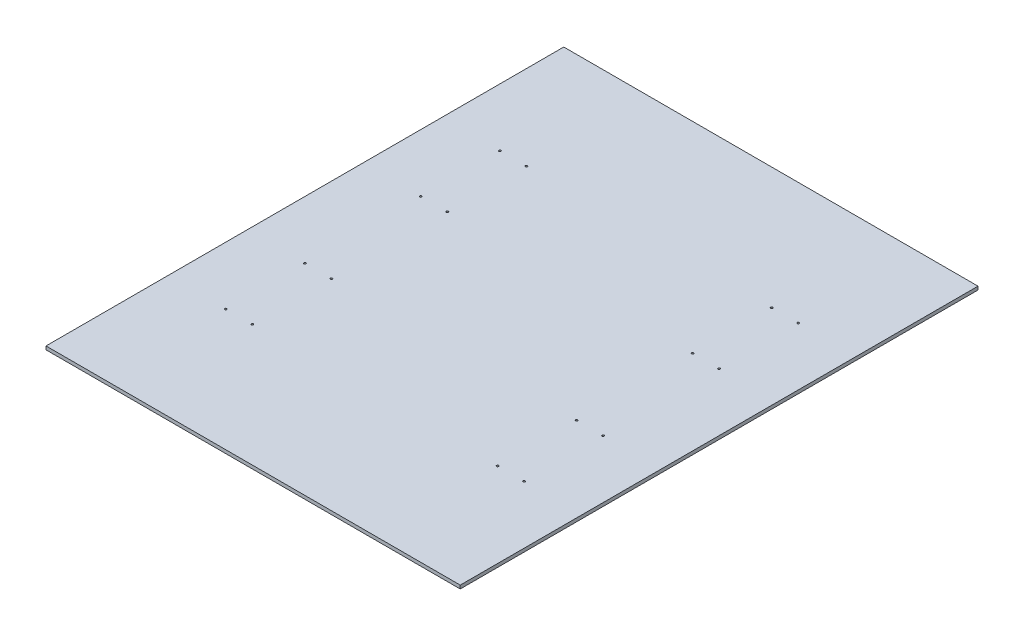
ISO-10303-21;
HEADER;
FILE_DESCRIPTION(('STEP AP214'),'2;1');
FILE_NAME('part.step','',(''),(''),'','','');
FILE_SCHEMA(('AUTOMOTIVE_DESIGN { 1 0 10303 214 1 1 1 1 }'));
ENDSEC;
DATA;
#1=APPLICATION_CONTEXT('core data for automotive mechanical design processes');
#2=APPLICATION_PROTOCOL_DEFINITION('international standard','automotive_design',2000,#1);
#3=PRODUCT_CONTEXT('',#1,'mechanical');
#4=PRODUCT('Part','Part','',(#3));
#5=PRODUCT_RELATED_PRODUCT_CATEGORY('part','',(#4));
#6=PRODUCT_DEFINITION_FORMATION('','',#4);
#7=PRODUCT_DEFINITION_CONTEXT('part definition',#1,'design');
#8=PRODUCT_DEFINITION('design','',#6,#7);
#9=PRODUCT_DEFINITION_SHAPE('','',#8);
#10=(LENGTH_UNIT() NAMED_UNIT(*) SI_UNIT(.MILLI.,.METRE.));
#11=(NAMED_UNIT(*) PLANE_ANGLE_UNIT() SI_UNIT($,.RADIAN.));
#12=(NAMED_UNIT(*) SI_UNIT($,.STERADIAN.) SOLID_ANGLE_UNIT());
#13=UNCERTAINTY_MEASURE_WITH_UNIT(LENGTH_MEASURE(1.E-05),#10,'distance_accuracy_value','');
#14=(GEOMETRIC_REPRESENTATION_CONTEXT(3) GLOBAL_UNCERTAINTY_ASSIGNED_CONTEXT((#13)) GLOBAL_UNIT_ASSIGNED_CONTEXT((#10,
#11,#12)) REPRESENTATION_CONTEXT('',''));
#15=CARTESIAN_POINT('',(0.,0.,0.));
#16=DIRECTION('',(0.,0.,1.));
#17=DIRECTION('',(1.,0.,0.));
#18=AXIS2_PLACEMENT_3D('',#15,#16,#17);
#19=CARTESIAN_POINT('',(609.6,10.,-762.));
#20=DIRECTION('',(-1.,0.,0.));
#21=DIRECTION('',(0.,0.,1.));
#22=AXIS2_PLACEMENT_3D('',#19,#20,#21);
#23=PLANE('',#22);
#24=DIRECTION('',(0.,0.,-1.));
#25=VECTOR('',#24,1.);
#26=CARTESIAN_POINT('',(609.6,0.,-762.));
#27=LINE('',#26,#25);
#28=CARTESIAN_POINT('',(609.6,0.,762.));
#29=VERTEX_POINT('',#28);
#30=CARTESIAN_POINT('',(609.6,0.,-762.));
#31=VERTEX_POINT('',#30);
#32=EDGE_CURVE('E112',#29,#31,#27,.T.);
#33=ORIENTED_EDGE('',*,*,#32,.T.);
#34=DIRECTION('',(0.,-1.,0.));
#35=VECTOR('',#34,1.);
#36=CARTESIAN_POINT('',(609.6,10.,-762.));
#37=LINE('',#36,#35);
#38=CARTESIAN_POINT('',(609.6,10.,-762.));
#39=VERTEX_POINT('',#38);
#40=EDGE_CURVE('E11',#39,#31,#37,.T.);
#41=ORIENTED_EDGE('',*,*,#40,.F.);
#42=DIRECTION('',(0.,0.,-1.));
#43=VECTOR('',#42,1.);
#44=CARTESIAN_POINT('',(609.6,10.,-762.));
#45=LINE('',#44,#43);
#46=CARTESIAN_POINT('',(609.6,10.,762.));
#47=VERTEX_POINT('',#46);
#48=EDGE_CURVE('E96',#47,#39,#45,.T.);
#49=ORIENTED_EDGE('',*,*,#48,.F.);
#50=DIRECTION('',(0.,-1.,0.));
#51=VECTOR('',#50,1.);
#52=CARTESIAN_POINT('',(609.6,10.,762.));
#53=LINE('',#52,#51);
#54=EDGE_CURVE('E108',#47,#29,#53,.T.);
#55=ORIENTED_EDGE('',*,*,#54,.T.);
#56=EDGE_LOOP('',(#33,#41,#49,#55));
#57=FACE_BOUND('',#56,.T.);
#58=ADVANCED_FACE('F44',(#57),#23,.F.);
#59=CARTESIAN_POINT('',(-609.6,10.,-762.));
#60=DIRECTION('',(0.,0.,1.));
#61=DIRECTION('',(1.,0.,0.));
#62=AXIS2_PLACEMENT_3D('',#59,#60,#61);
#63=PLANE('',#62);
#64=DIRECTION('',(-1.,0.,0.));
#65=VECTOR('',#64,1.);
#66=CARTESIAN_POINT('',(-609.6,0.,-762.));
#67=LINE('',#66,#65);
#68=CARTESIAN_POINT('',(-609.6,0.,-762.));
#69=VERTEX_POINT('',#68);
#70=EDGE_CURVE('E101',#31,#69,#67,.T.);
#71=ORIENTED_EDGE('',*,*,#70,.T.);
#72=DIRECTION('',(0.,-1.,0.));
#73=VECTOR('',#72,1.);
#74=CARTESIAN_POINT('',(-609.6,10.,-762.));
#75=LINE('',#74,#73);
#76=CARTESIAN_POINT('',(-609.6,10.,-762.));
#77=VERTEX_POINT('',#76);
#78=EDGE_CURVE('E53',#77,#69,#75,.T.);
#79=ORIENTED_EDGE('',*,*,#78,.F.);
#80=DIRECTION('',(-1.,0.,0.));
#81=VECTOR('',#80,1.);
#82=CARTESIAN_POINT('',(-609.6,10.,-762.));
#83=LINE('',#82,#81);
#84=EDGE_CURVE('E91',#39,#77,#83,.T.);
#85=ORIENTED_EDGE('',*,*,#84,.F.);
#86=ORIENTED_EDGE('',*,*,#40,.T.);
#87=EDGE_LOOP('',(#71,#79,#85,#86));
#88=FACE_BOUND('',#87,.T.);
#89=ADVANCED_FACE('F100',(#88),#63,.F.);
#90=CARTESIAN_POINT('',(-609.6,10.,-762.));
#91=DIRECTION('',(1.,0.,0.));
#92=DIRECTION('',(0.,0.,-1.));
#93=AXIS2_PLACEMENT_3D('',#90,#91,#92);
#94=PLANE('',#93);
#95=DIRECTION('',(0.,0.,1.));
#96=VECTOR('',#95,1.);
#97=CARTESIAN_POINT('',(-609.6,0.,-762.));
#98=LINE('',#97,#96);
#99=CARTESIAN_POINT('',(-609.6,0.,762.));
#100=VERTEX_POINT('',#99);
#101=EDGE_CURVE('E78',#69,#100,#98,.T.);
#102=ORIENTED_EDGE('',*,*,#101,.T.);
#103=DIRECTION('',(0.,-1.,0.));
#104=VECTOR('',#103,1.);
#105=CARTESIAN_POINT('',(-609.6,10.,762.));
#106=LINE('',#105,#104);
#107=CARTESIAN_POINT('',(-609.6,10.,762.));
#108=VERTEX_POINT('',#107);
#109=EDGE_CURVE('E103',#108,#100,#106,.T.);
#110=ORIENTED_EDGE('',*,*,#109,.F.);
#111=DIRECTION('',(0.,0.,1.));
#112=VECTOR('',#111,1.);
#113=CARTESIAN_POINT('',(-609.6,10.,-762.));
#114=LINE('',#113,#112);
#115=EDGE_CURVE('E94',#77,#108,#114,.T.);
#116=ORIENTED_EDGE('',*,*,#115,.F.);
#117=ORIENTED_EDGE('',*,*,#78,.T.);
#118=EDGE_LOOP('',(#102,#110,#116,#117));
#119=FACE_BOUND('',#118,.T.);
#120=ADVANCED_FACE('F104',(#119),#94,.F.);
#121=CARTESIAN_POINT('',(-609.6,10.,762.));
#122=DIRECTION('',(0.,0.,-1.));
#123=DIRECTION('',(-1.,0.,0.));
#124=AXIS2_PLACEMENT_3D('',#121,#122,#123);
#125=PLANE('',#124);
#126=DIRECTION('',(1.,0.,0.));
#127=VECTOR('',#126,1.);
#128=CARTESIAN_POINT('',(-609.6,0.,762.));
#129=LINE('',#128,#127);
#130=EDGE_CURVE('E84',#100,#29,#129,.T.);
#131=ORIENTED_EDGE('',*,*,#130,.T.);
#132=ORIENTED_EDGE('',*,*,#54,.F.);
#133=DIRECTION('',(1.,0.,0.));
#134=VECTOR('',#133,1.);
#135=CARTESIAN_POINT('',(-609.6,10.,762.));
#136=LINE('',#135,#134);
#137=EDGE_CURVE('E61',#108,#47,#136,.T.);
#138=ORIENTED_EDGE('',*,*,#137,.F.);
#139=ORIENTED_EDGE('',*,*,#109,.T.);
#140=EDGE_LOOP('',(#131,#132,#138,#139));
#141=FACE_BOUND('',#140,.T.);
#142=ADVANCED_FACE('F126',(#141),#125,.F.);
#143=CARTESIAN_POINT('',(0.,10.,0.));
#144=DIRECTION('',(0.,1.,0.));
#145=DIRECTION('',(0.,0.,1.));
#146=AXIS2_PLACEMENT_3D('',#143,#144,#145);
#147=PLANE('',#146);
#148=CARTESIAN_POINT('',(439.,10.,170.65));
#149=DIRECTION('',(0.,1.,0.));
#150=DIRECTION('',(0.,0.,-1.));
#151=AXIS2_PLACEMENT_3D('',#148,#149,#150);
#152=CIRCLE('',#151,2.99999999999999);
#153=CARTESIAN_POINT('',(439.,10.,167.65));
#154=VERTEX_POINT('',#153);
#155=EDGE_CURVE('E237',#154,#154,#152,.T.);
#156=ORIENTED_EDGE('',*,*,#155,.F.);
#157=EDGE_LOOP('',(#156));
#158=FACE_BOUND('',#157,.T.);
#159=CARTESIAN_POINT('',(361.,10.,170.65));
#160=DIRECTION('',(0.,1.,0.));
#161=DIRECTION('',(0.,0.,-1.));
#162=AXIS2_PLACEMENT_3D('',#159,#160,#161);
#163=CIRCLE('',#162,2.99999999999999);
#164=CARTESIAN_POINT('',(361.,10.,167.65));
#165=VERTEX_POINT('',#164);
#166=EDGE_CURVE('E245',#165,#165,#163,.T.);
#167=ORIENTED_EDGE('',*,*,#166,.F.);
#168=EDGE_LOOP('',(#167));
#169=FACE_BOUND('',#168,.T.);
#170=CARTESIAN_POINT('',(361.,10.,403.35));
#171=DIRECTION('',(0.,1.,0.));
#172=DIRECTION('',(0.,0.,-1.));
#173=AXIS2_PLACEMENT_3D('',#170,#171,#172);
#174=CIRCLE('',#173,2.99999999999999);
#175=CARTESIAN_POINT('',(361.,10.,400.35));
#176=VERTEX_POINT('',#175);
#177=EDGE_CURVE('E253',#176,#176,#174,.T.);
#178=ORIENTED_EDGE('',*,*,#177,.F.);
#179=EDGE_LOOP('',(#178));
#180=FACE_BOUND('',#179,.T.);
#181=CARTESIAN_POINT('',(439.,10.,403.35));
#182=DIRECTION('',(0.,1.,0.));
#183=DIRECTION('',(0.,0.,-1.));
#184=AXIS2_PLACEMENT_3D('',#181,#182,#183);
#185=CIRCLE('',#184,2.99999999999999);
#186=CARTESIAN_POINT('',(439.,10.,400.35));
#187=VERTEX_POINT('',#186);
#188=EDGE_CURVE('E229',#187,#187,#185,.T.);
#189=ORIENTED_EDGE('',*,*,#188,.F.);
#190=EDGE_LOOP('',(#189));
#191=FACE_BOUND('',#190,.T.);
#192=CARTESIAN_POINT('',(439.,10.,-170.65));
#193=DIRECTION('',(0.,-1.,0.));
#194=DIRECTION('',(0.,0.,1.));
#195=AXIS2_PLACEMENT_3D('',#192,#193,#194);
#196=CIRCLE('',#195,2.99999999999999);
#197=CARTESIAN_POINT('',(439.,10.,-167.65));
#198=VERTEX_POINT('',#197);
#199=EDGE_CURVE('E205',#198,#198,#196,.T.);
#200=ORIENTED_EDGE('',*,*,#199,.T.);
#201=EDGE_LOOP('',(#200));
#202=FACE_BOUND('',#201,.T.);
#203=CARTESIAN_POINT('',(361.,10.,-170.65));
#204=DIRECTION('',(0.,-1.,0.));
#205=DIRECTION('',(0.,0.,1.));
#206=AXIS2_PLACEMENT_3D('',#203,#204,#205);
#207=CIRCLE('',#206,2.99999999999999);
#208=CARTESIAN_POINT('',(361.,10.,-167.65));
#209=VERTEX_POINT('',#208);
#210=EDGE_CURVE('E214',#209,#209,#207,.T.);
#211=ORIENTED_EDGE('',*,*,#210,.T.);
#212=EDGE_LOOP('',(#211));
#213=FACE_BOUND('',#212,.T.);
#214=CARTESIAN_POINT('',(361.,10.,-403.35));
#215=DIRECTION('',(0.,-1.,0.));
#216=DIRECTION('',(0.,0.,1.));
#217=AXIS2_PLACEMENT_3D('',#214,#215,#216);
#218=CIRCLE('',#217,2.99999999999999);
#219=CARTESIAN_POINT('',(361.,10.,-400.35));
#220=VERTEX_POINT('',#219);
#221=EDGE_CURVE('E222',#220,#220,#218,.T.);
#222=ORIENTED_EDGE('',*,*,#221,.T.);
#223=EDGE_LOOP('',(#222));
#224=FACE_BOUND('',#223,.T.);
#225=CARTESIAN_POINT('',(439.,10.,-403.35));
#226=DIRECTION('',(0.,-1.,0.));
#227=DIRECTION('',(0.,0.,1.));
#228=AXIS2_PLACEMENT_3D('',#225,#226,#227);
#229=CIRCLE('',#228,2.99999999999999);
#230=CARTESIAN_POINT('',(439.,10.,-400.35));
#231=VERTEX_POINT('',#230);
#232=EDGE_CURVE('E197',#231,#231,#229,.T.);
#233=ORIENTED_EDGE('',*,*,#232,.T.);
#234=EDGE_LOOP('',(#233));
#235=FACE_BOUND('',#234,.T.);
#236=CARTESIAN_POINT('',(-439.,10.,170.65));
#237=DIRECTION('',(0.,-1.,0.));
#238=DIRECTION('',(0.,0.,-1.));
#239=AXIS2_PLACEMENT_3D('',#236,#237,#238);
#240=CIRCLE('',#239,2.99999999999999);
#241=CARTESIAN_POINT('',(-439.,10.,167.65));
#242=VERTEX_POINT('',#241);
#243=EDGE_CURVE('E173',#242,#242,#240,.T.);
#244=ORIENTED_EDGE('',*,*,#243,.T.);
#245=EDGE_LOOP('',(#244));
#246=FACE_BOUND('',#245,.T.);
#247=CARTESIAN_POINT('',(-361.,10.,170.65));
#248=DIRECTION('',(0.,-1.,0.));
#249=DIRECTION('',(0.,0.,-1.));
#250=AXIS2_PLACEMENT_3D('',#247,#248,#249);
#251=CIRCLE('',#250,2.99999999999999);
#252=CARTESIAN_POINT('',(-361.,10.,167.65));
#253=VERTEX_POINT('',#252);
#254=EDGE_CURVE('E182',#253,#253,#251,.T.);
#255=ORIENTED_EDGE('',*,*,#254,.T.);
#256=EDGE_LOOP('',(#255));
#257=FACE_BOUND('',#256,.T.);
#258=CARTESIAN_POINT('',(-361.,10.,403.35));
#259=DIRECTION('',(0.,-1.,0.));
#260=DIRECTION('',(0.,0.,-1.));
#261=AXIS2_PLACEMENT_3D('',#258,#259,#260);
#262=CIRCLE('',#261,2.99999999999999);
#263=CARTESIAN_POINT('',(-361.,10.,400.35));
#264=VERTEX_POINT('',#263);
#265=EDGE_CURVE('E190',#264,#264,#262,.T.);
#266=ORIENTED_EDGE('',*,*,#265,.T.);
#267=EDGE_LOOP('',(#266));
#268=FACE_BOUND('',#267,.T.);
#269=CARTESIAN_POINT('',(-439.,10.,403.35));
#270=DIRECTION('',(0.,-1.,0.));
#271=DIRECTION('',(0.,0.,-1.));
#272=AXIS2_PLACEMENT_3D('',#269,#270,#271);
#273=CIRCLE('',#272,2.99999999999999);
#274=CARTESIAN_POINT('',(-439.,10.,400.35));
#275=VERTEX_POINT('',#274);
#276=EDGE_CURVE('E165',#275,#275,#273,.T.);
#277=ORIENTED_EDGE('',*,*,#276,.T.);
#278=EDGE_LOOP('',(#277));
#279=FACE_BOUND('',#278,.T.);
#280=CARTESIAN_POINT('',(-439.,10.,-170.65));
#281=DIRECTION('',(0.,1.,0.));
#282=DIRECTION('',(0.,0.,1.));
#283=AXIS2_PLACEMENT_3D('',#280,#281,#282);
#284=CIRCLE('',#283,2.99999999999999);
#285=CARTESIAN_POINT('',(-439.,10.,-167.65));
#286=VERTEX_POINT('',#285);
#287=EDGE_CURVE('E145',#286,#286,#284,.T.);
#288=ORIENTED_EDGE('',*,*,#287,.F.);
#289=EDGE_LOOP('',(#288));
#290=FACE_BOUND('',#289,.T.);
#291=CARTESIAN_POINT('',(-361.,10.,-170.65));
#292=DIRECTION('',(0.,1.,0.));
#293=DIRECTION('',(0.,0.,1.));
#294=AXIS2_PLACEMENT_3D('',#291,#292,#293);
#295=CIRCLE('',#294,2.99999999999999);
#296=CARTESIAN_POINT('',(-361.,10.,-167.65));
#297=VERTEX_POINT('',#296);
#298=EDGE_CURVE('E154',#297,#297,#295,.T.);
#299=ORIENTED_EDGE('',*,*,#298,.F.);
#300=EDGE_LOOP('',(#299));
#301=FACE_BOUND('',#300,.T.);
#302=CARTESIAN_POINT('',(-361.,10.,-403.35));
#303=DIRECTION('',(0.,1.,0.));
#304=DIRECTION('',(0.,0.,1.));
#305=AXIS2_PLACEMENT_3D('',#302,#303,#304);
#306=CIRCLE('',#305,2.99999999999999);
#307=CARTESIAN_POINT('',(-361.,10.,-400.35));
#308=VERTEX_POINT('',#307);
#309=EDGE_CURVE('E137',#308,#308,#306,.T.);
#310=ORIENTED_EDGE('',*,*,#309,.F.);
#311=EDGE_LOOP('',(#310));
#312=FACE_BOUND('',#311,.T.);
#313=CARTESIAN_POINT('',(-439.,10.,-403.35));
#314=DIRECTION('',(0.,1.,0.));
#315=DIRECTION('',(0.,0.,1.));
#316=AXIS2_PLACEMENT_3D('',#313,#314,#315);
#317=CIRCLE('',#316,2.99999999999999);
#318=CARTESIAN_POINT('',(-439.,10.,-400.35));
#319=VERTEX_POINT('',#318);
#320=EDGE_CURVE('E133',#319,#319,#317,.T.);
#321=ORIENTED_EDGE('',*,*,#320,.F.);
#322=EDGE_LOOP('',(#321));
#323=FACE_BOUND('',#322,.T.);
#324=ORIENTED_EDGE('',*,*,#48,.T.);
#325=ORIENTED_EDGE('',*,*,#84,.T.);
#326=ORIENTED_EDGE('',*,*,#115,.T.);
#327=ORIENTED_EDGE('',*,*,#137,.T.);
#328=EDGE_LOOP('',(#324,#325,#326,#327));
#329=FACE_BOUND('',#328,.T.);
#330=ADVANCED_FACE('F92',(#158,#169,#180,#191,#202,#213,#224,#235,#246,#257,#268,#279,#290,#301,
#312,#323,#329),#147,.T.);
#331=CARTESIAN_POINT('',(0.,0.,0.));
#332=DIRECTION('',(0.,1.,0.));
#333=DIRECTION('',(0.,0.,1.));
#334=AXIS2_PLACEMENT_3D('',#331,#332,#333);
#335=PLANE('',#334);
#336=CARTESIAN_POINT('',(439.,0.,170.65));
#337=DIRECTION('',(0.,1.,0.));
#338=DIRECTION('',(0.,0.,-1.));
#339=AXIS2_PLACEMENT_3D('',#336,#337,#338);
#340=CIRCLE('',#339,2.99999999999999);
#341=CARTESIAN_POINT('',(439.,0.,167.65));
#342=VERTEX_POINT('',#341);
#343=EDGE_CURVE('E241',#342,#342,#340,.T.);
#344=ORIENTED_EDGE('',*,*,#343,.T.);
#345=EDGE_LOOP('',(#344));
#346=FACE_BOUND('',#345,.T.);
#347=CARTESIAN_POINT('',(361.,0.,170.65));
#348=DIRECTION('',(0.,1.,0.));
#349=DIRECTION('',(0.,0.,-1.));
#350=AXIS2_PLACEMENT_3D('',#347,#348,#349);
#351=CIRCLE('',#350,2.99999999999999);
#352=CARTESIAN_POINT('',(361.,0.,167.65));
#353=VERTEX_POINT('',#352);
#354=EDGE_CURVE('E249',#353,#353,#351,.T.);
#355=ORIENTED_EDGE('',*,*,#354,.T.);
#356=EDGE_LOOP('',(#355));
#357=FACE_BOUND('',#356,.T.);
#358=CARTESIAN_POINT('',(361.,0.,403.35));
#359=DIRECTION('',(0.,1.,0.));
#360=DIRECTION('',(0.,0.,-1.));
#361=AXIS2_PLACEMENT_3D('',#358,#359,#360);
#362=CIRCLE('',#361,2.99999999999999);
#363=CARTESIAN_POINT('',(361.,0.,400.35));
#364=VERTEX_POINT('',#363);
#365=EDGE_CURVE('E233',#364,#364,#362,.T.);
#366=ORIENTED_EDGE('',*,*,#365,.T.);
#367=EDGE_LOOP('',(#366));
#368=FACE_BOUND('',#367,.T.);
#369=CARTESIAN_POINT('',(439.,0.,403.35));
#370=DIRECTION('',(0.,1.,0.));
#371=DIRECTION('',(0.,0.,-1.));
#372=AXIS2_PLACEMENT_3D('',#369,#370,#371);
#373=CIRCLE('',#372,2.99999999999999);
#374=CARTESIAN_POINT('',(439.,0.,400.35));
#375=VERTEX_POINT('',#374);
#376=EDGE_CURVE('E210',#375,#375,#373,.T.);
#377=ORIENTED_EDGE('',*,*,#376,.T.);
#378=EDGE_LOOP('',(#377));
#379=FACE_BOUND('',#378,.T.);
#380=CARTESIAN_POINT('',(439.,0.,-170.65));
#381=DIRECTION('',(0.,-1.,0.));
#382=DIRECTION('',(0.,0.,1.));
#383=AXIS2_PLACEMENT_3D('',#380,#381,#382);
#384=CIRCLE('',#383,2.99999999999999);
#385=CARTESIAN_POINT('',(439.,0.,-167.65));
#386=VERTEX_POINT('',#385);
#387=EDGE_CURVE('E209',#386,#386,#384,.T.);
#388=ORIENTED_EDGE('',*,*,#387,.F.);
#389=EDGE_LOOP('',(#388));
#390=FACE_BOUND('',#389,.T.);
#391=CARTESIAN_POINT('',(361.,0.,-170.65));
#392=DIRECTION('',(0.,-1.,0.));
#393=DIRECTION('',(0.,0.,1.));
#394=AXIS2_PLACEMENT_3D('',#391,#392,#393);
#395=CIRCLE('',#394,2.99999999999999);
#396=CARTESIAN_POINT('',(361.,0.,-167.65));
#397=VERTEX_POINT('',#396);
#398=EDGE_CURVE('E218',#397,#397,#395,.T.);
#399=ORIENTED_EDGE('',*,*,#398,.F.);
#400=EDGE_LOOP('',(#399));
#401=FACE_BOUND('',#400,.T.);
#402=CARTESIAN_POINT('',(361.,0.,-403.35));
#403=DIRECTION('',(0.,-1.,0.));
#404=DIRECTION('',(0.,0.,1.));
#405=AXIS2_PLACEMENT_3D('',#402,#403,#404);
#406=CIRCLE('',#405,2.99999999999999);
#407=CARTESIAN_POINT('',(361.,0.,-400.35));
#408=VERTEX_POINT('',#407);
#409=EDGE_CURVE('E201',#408,#408,#406,.T.);
#410=ORIENTED_EDGE('',*,*,#409,.F.);
#411=EDGE_LOOP('',(#410));
#412=FACE_BOUND('',#411,.T.);
#413=CARTESIAN_POINT('',(439.,0.,-403.35));
#414=DIRECTION('',(0.,-1.,0.));
#415=DIRECTION('',(0.,0.,1.));
#416=AXIS2_PLACEMENT_3D('',#413,#414,#415);
#417=CIRCLE('',#416,2.99999999999999);
#418=CARTESIAN_POINT('',(439.,0.,-400.35));
#419=VERTEX_POINT('',#418);
#420=EDGE_CURVE('E178',#419,#419,#417,.T.);
#421=ORIENTED_EDGE('',*,*,#420,.F.);
#422=EDGE_LOOP('',(#421));
#423=FACE_BOUND('',#422,.T.);
#424=CARTESIAN_POINT('',(-439.,0.,170.65));
#425=DIRECTION('',(0.,-1.,0.));
#426=DIRECTION('',(0.,0.,-1.));
#427=AXIS2_PLACEMENT_3D('',#424,#425,#426);
#428=CIRCLE('',#427,2.99999999999999);
#429=CARTESIAN_POINT('',(-439.,0.,167.65));
#430=VERTEX_POINT('',#429);
#431=EDGE_CURVE('E177',#430,#430,#428,.T.);
#432=ORIENTED_EDGE('',*,*,#431,.F.);
#433=EDGE_LOOP('',(#432));
#434=FACE_BOUND('',#433,.T.);
#435=CARTESIAN_POINT('',(-361.,0.,170.65));
#436=DIRECTION('',(0.,-1.,0.));
#437=DIRECTION('',(0.,0.,-1.));
#438=AXIS2_PLACEMENT_3D('',#435,#436,#437);
#439=CIRCLE('',#438,2.99999999999999);
#440=CARTESIAN_POINT('',(-361.,0.,167.65));
#441=VERTEX_POINT('',#440);
#442=EDGE_CURVE('E186',#441,#441,#439,.T.);
#443=ORIENTED_EDGE('',*,*,#442,.F.);
#444=EDGE_LOOP('',(#443));
#445=FACE_BOUND('',#444,.T.);
#446=CARTESIAN_POINT('',(-361.,0.,403.35));
#447=DIRECTION('',(0.,-1.,0.));
#448=DIRECTION('',(0.,0.,-1.));
#449=AXIS2_PLACEMENT_3D('',#446,#447,#448);
#450=CIRCLE('',#449,2.99999999999999);
#451=CARTESIAN_POINT('',(-361.,0.,400.35));
#452=VERTEX_POINT('',#451);
#453=EDGE_CURVE('E169',#452,#452,#450,.T.);
#454=ORIENTED_EDGE('',*,*,#453,.F.);
#455=EDGE_LOOP('',(#454));
#456=FACE_BOUND('',#455,.T.);
#457=CARTESIAN_POINT('',(-439.,0.,403.35));
#458=DIRECTION('',(0.,-1.,0.));
#459=DIRECTION('',(0.,0.,-1.));
#460=AXIS2_PLACEMENT_3D('',#457,#458,#459);
#461=CIRCLE('',#460,2.99999999999999);
#462=CARTESIAN_POINT('',(-439.,0.,400.35));
#463=VERTEX_POINT('',#462);
#464=EDGE_CURVE('E146',#463,#463,#461,.T.);
#465=ORIENTED_EDGE('',*,*,#464,.F.);
#466=EDGE_LOOP('',(#465));
#467=FACE_BOUND('',#466,.T.);
#468=CARTESIAN_POINT('',(-439.,0.,-170.65));
#469=DIRECTION('',(0.,1.,0.));
#470=DIRECTION('',(0.,0.,1.));
#471=AXIS2_PLACEMENT_3D('',#468,#469,#470);
#472=CIRCLE('',#471,2.99999999999999);
#473=CARTESIAN_POINT('',(-439.,0.,-167.65));
#474=VERTEX_POINT('',#473);
#475=EDGE_CURVE('E141',#474,#474,#472,.T.);
#476=ORIENTED_EDGE('',*,*,#475,.T.);
#477=EDGE_LOOP('',(#476));
#478=FACE_BOUND('',#477,.T.);
#479=CARTESIAN_POINT('',(-361.,0.,-170.65));
#480=DIRECTION('',(0.,1.,0.));
#481=DIRECTION('',(0.,0.,1.));
#482=AXIS2_PLACEMENT_3D('',#479,#480,#481);
#483=CIRCLE('',#482,2.99999999999999);
#484=CARTESIAN_POINT('',(-361.,0.,-167.65));
#485=VERTEX_POINT('',#484);
#486=EDGE_CURVE('E150',#485,#485,#483,.T.);
#487=ORIENTED_EDGE('',*,*,#486,.T.);
#488=EDGE_LOOP('',(#487));
#489=FACE_BOUND('',#488,.T.);
#490=CARTESIAN_POINT('',(-361.,0.,-403.35));
#491=DIRECTION('',(0.,1.,0.));
#492=DIRECTION('',(0.,0.,1.));
#493=AXIS2_PLACEMENT_3D('',#490,#491,#492);
#494=CIRCLE('',#493,2.99999999999999);
#495=CARTESIAN_POINT('',(-361.,0.,-400.35));
#496=VERTEX_POINT('',#495);
#497=EDGE_CURVE('E158',#496,#496,#494,.T.);
#498=ORIENTED_EDGE('',*,*,#497,.T.);
#499=EDGE_LOOP('',(#498));
#500=FACE_BOUND('',#499,.T.);
#501=CARTESIAN_POINT('',(-439.,0.,-403.35));
#502=DIRECTION('',(0.,1.,0.));
#503=DIRECTION('',(0.,0.,1.));
#504=AXIS2_PLACEMENT_3D('',#501,#502,#503);
#505=CIRCLE('',#504,2.99999999999999);
#506=CARTESIAN_POINT('',(-439.,0.,-400.35));
#507=VERTEX_POINT('',#506);
#508=EDGE_CURVE('E116',#507,#507,#505,.T.);
#509=ORIENTED_EDGE('',*,*,#508,.T.);
#510=EDGE_LOOP('',(#509));
#511=FACE_BOUND('',#510,.T.);
#512=ORIENTED_EDGE('',*,*,#32,.F.);
#513=ORIENTED_EDGE('',*,*,#130,.F.);
#514=ORIENTED_EDGE('',*,*,#101,.F.);
#515=ORIENTED_EDGE('',*,*,#70,.F.);
#516=EDGE_LOOP('',(#512,#513,#514,#515));
#517=FACE_BOUND('',#516,.T.);
#518=ADVANCED_FACE('F129',(#346,#357,#368,#379,#390,#401,#412,#423,#434,#445,#456,#467,#478,
#489,#500,#511,#517),#335,.F.);
#519=CARTESIAN_POINT('',(-439.,0.,-403.35));
#520=DIRECTION('',(0.,1.,0.));
#521=DIRECTION('',(0.,0.,1.));
#522=AXIS2_PLACEMENT_3D('',#519,#520,#521);
#523=CYLINDRICAL_SURFACE('',#522,2.99999999999999);
#524=ORIENTED_EDGE('',*,*,#508,.F.);
#525=EDGE_LOOP('',(#524));
#526=FACE_BOUND('',#525,.T.);
#527=ORIENTED_EDGE('',*,*,#320,.T.);
#528=EDGE_LOOP('',(#527));
#529=FACE_BOUND('',#528,.T.);
#530=ADVANCED_FACE('F301',(#526,#529),#523,.F.);
#531=CARTESIAN_POINT('',(-361.,0.,-403.35));
#532=DIRECTION('',(0.,1.,0.));
#533=DIRECTION('',(0.,0.,1.));
#534=AXIS2_PLACEMENT_3D('',#531,#532,#533);
#535=CYLINDRICAL_SURFACE('',#534,2.99999999999999);
#536=ORIENTED_EDGE('',*,*,#497,.F.);
#537=EDGE_LOOP('',(#536));
#538=FACE_BOUND('',#537,.T.);
#539=ORIENTED_EDGE('',*,*,#309,.T.);
#540=EDGE_LOOP('',(#539));
#541=FACE_BOUND('',#540,.T.);
#542=ADVANCED_FACE('F303',(#538,#541),#535,.F.);
#543=CARTESIAN_POINT('',(-361.,0.,-170.65));
#544=DIRECTION('',(0.,1.,0.));
#545=DIRECTION('',(0.,0.,1.));
#546=AXIS2_PLACEMENT_3D('',#543,#544,#545);
#547=CYLINDRICAL_SURFACE('',#546,2.99999999999999);
#548=ORIENTED_EDGE('',*,*,#486,.F.);
#549=EDGE_LOOP('',(#548));
#550=FACE_BOUND('',#549,.T.);
#551=ORIENTED_EDGE('',*,*,#298,.T.);
#552=EDGE_LOOP('',(#551));
#553=FACE_BOUND('',#552,.T.);
#554=ADVANCED_FACE('F310',(#550,#553),#547,.F.);
#555=CARTESIAN_POINT('',(-439.,0.,-170.65));
#556=DIRECTION('',(0.,1.,0.));
#557=DIRECTION('',(0.,0.,1.));
#558=AXIS2_PLACEMENT_3D('',#555,#556,#557);
#559=CYLINDRICAL_SURFACE('',#558,2.99999999999999);
#560=ORIENTED_EDGE('',*,*,#475,.F.);
#561=EDGE_LOOP('',(#560));
#562=FACE_BOUND('',#561,.T.);
#563=ORIENTED_EDGE('',*,*,#287,.T.);
#564=EDGE_LOOP('',(#563));
#565=FACE_BOUND('',#564,.T.);
#566=ADVANCED_FACE('F371',(#562,#565),#559,.F.);
#567=CARTESIAN_POINT('',(-439.,0.,403.35));
#568=DIRECTION('',(0.,1.,0.));
#569=DIRECTION('',(0.,0.,1.));
#570=AXIS2_PLACEMENT_3D('',#567,#568,#569);
#571=CYLINDRICAL_SURFACE('',#570,2.99999999999999);
#572=ORIENTED_EDGE('',*,*,#464,.T.);
#573=EDGE_LOOP('',(#572));
#574=FACE_BOUND('',#573,.T.);
#575=ORIENTED_EDGE('',*,*,#276,.F.);
#576=EDGE_LOOP('',(#575));
#577=FACE_BOUND('',#576,.T.);
#578=ADVANCED_FACE('F380',(#574,#577),#571,.F.);
#579=CARTESIAN_POINT('',(-361.,0.,403.35));
#580=DIRECTION('',(0.,1.,0.));
#581=DIRECTION('',(0.,0.,1.));
#582=AXIS2_PLACEMENT_3D('',#579,#580,#581);
#583=CYLINDRICAL_SURFACE('',#582,2.99999999999999);
#584=ORIENTED_EDGE('',*,*,#453,.T.);
#585=EDGE_LOOP('',(#584));
#586=FACE_BOUND('',#585,.T.);
#587=ORIENTED_EDGE('',*,*,#265,.F.);
#588=EDGE_LOOP('',(#587));
#589=FACE_BOUND('',#588,.T.);
#590=ADVANCED_FACE('F388',(#586,#589),#583,.F.);
#591=CARTESIAN_POINT('',(-361.,0.,170.65));
#592=DIRECTION('',(0.,1.,0.));
#593=DIRECTION('',(0.,0.,1.));
#594=AXIS2_PLACEMENT_3D('',#591,#592,#593);
#595=CYLINDRICAL_SURFACE('',#594,2.99999999999999);
#596=ORIENTED_EDGE('',*,*,#442,.T.);
#597=EDGE_LOOP('',(#596));
#598=FACE_BOUND('',#597,.T.);
#599=ORIENTED_EDGE('',*,*,#254,.F.);
#600=EDGE_LOOP('',(#599));
#601=FACE_BOUND('',#600,.T.);
#602=ADVANCED_FACE('F397',(#598,#601),#595,.F.);
#603=CARTESIAN_POINT('',(-439.,0.,170.65));
#604=DIRECTION('',(0.,1.,0.));
#605=DIRECTION('',(0.,0.,1.));
#606=AXIS2_PLACEMENT_3D('',#603,#604,#605);
#607=CYLINDRICAL_SURFACE('',#606,2.99999999999999);
#608=ORIENTED_EDGE('',*,*,#431,.T.);
#609=EDGE_LOOP('',(#608));
#610=FACE_BOUND('',#609,.T.);
#611=ORIENTED_EDGE('',*,*,#243,.F.);
#612=EDGE_LOOP('',(#611));
#613=FACE_BOUND('',#612,.T.);
#614=ADVANCED_FACE('F406',(#610,#613),#607,.F.);
#615=CARTESIAN_POINT('',(439.,0.,-403.35));
#616=DIRECTION('',(0.,1.,0.));
#617=DIRECTION('',(0.,0.,1.));
#618=AXIS2_PLACEMENT_3D('',#615,#616,#617);
#619=CYLINDRICAL_SURFACE('',#618,2.99999999999999);
#620=ORIENTED_EDGE('',*,*,#420,.T.);
#621=EDGE_LOOP('',(#620));
#622=FACE_BOUND('',#621,.T.);
#623=ORIENTED_EDGE('',*,*,#232,.F.);
#624=EDGE_LOOP('',(#623));
#625=FACE_BOUND('',#624,.T.);
#626=ADVANCED_FACE('F415',(#622,#625),#619,.F.);
#627=CARTESIAN_POINT('',(361.,0.,-403.35));
#628=DIRECTION('',(0.,1.,0.));
#629=DIRECTION('',(0.,0.,1.));
#630=AXIS2_PLACEMENT_3D('',#627,#628,#629);
#631=CYLINDRICAL_SURFACE('',#630,2.99999999999999);
#632=ORIENTED_EDGE('',*,*,#409,.T.);
#633=EDGE_LOOP('',(#632));
#634=FACE_BOUND('',#633,.T.);
#635=ORIENTED_EDGE('',*,*,#221,.F.);
#636=EDGE_LOOP('',(#635));
#637=FACE_BOUND('',#636,.T.);
#638=ADVANCED_FACE('F424',(#634,#637),#631,.F.);
#639=CARTESIAN_POINT('',(361.,0.,-170.65));
#640=DIRECTION('',(0.,1.,0.));
#641=DIRECTION('',(0.,0.,1.));
#642=AXIS2_PLACEMENT_3D('',#639,#640,#641);
#643=CYLINDRICAL_SURFACE('',#642,2.99999999999999);
#644=ORIENTED_EDGE('',*,*,#398,.T.);
#645=EDGE_LOOP('',(#644));
#646=FACE_BOUND('',#645,.T.);
#647=ORIENTED_EDGE('',*,*,#210,.F.);
#648=EDGE_LOOP('',(#647));
#649=FACE_BOUND('',#648,.T.);
#650=ADVANCED_FACE('F433',(#646,#649),#643,.F.);
#651=CARTESIAN_POINT('',(439.,0.,-170.65));
#652=DIRECTION('',(0.,1.,0.));
#653=DIRECTION('',(0.,0.,1.));
#654=AXIS2_PLACEMENT_3D('',#651,#652,#653);
#655=CYLINDRICAL_SURFACE('',#654,2.99999999999999);
#656=ORIENTED_EDGE('',*,*,#387,.T.);
#657=EDGE_LOOP('',(#656));
#658=FACE_BOUND('',#657,.T.);
#659=ORIENTED_EDGE('',*,*,#199,.F.);
#660=EDGE_LOOP('',(#659));
#661=FACE_BOUND('',#660,.T.);
#662=ADVANCED_FACE('F442',(#658,#661),#655,.F.);
#663=CARTESIAN_POINT('',(439.,0.,403.35));
#664=DIRECTION('',(0.,1.,0.));
#665=DIRECTION('',(0.,0.,1.));
#666=AXIS2_PLACEMENT_3D('',#663,#664,#665);
#667=CYLINDRICAL_SURFACE('',#666,2.99999999999999);
#668=ORIENTED_EDGE('',*,*,#376,.F.);
#669=EDGE_LOOP('',(#668));
#670=FACE_BOUND('',#669,.T.);
#671=ORIENTED_EDGE('',*,*,#188,.T.);
#672=EDGE_LOOP('',(#671));
#673=FACE_BOUND('',#672,.T.);
#674=ADVANCED_FACE('F267',(#670,#673),#667,.F.);
#675=CARTESIAN_POINT('',(361.,0.,403.35));
#676=DIRECTION('',(0.,1.,0.));
#677=DIRECTION('',(0.,0.,1.));
#678=AXIS2_PLACEMENT_3D('',#675,#676,#677);
#679=CYLINDRICAL_SURFACE('',#678,2.99999999999999);
#680=ORIENTED_EDGE('',*,*,#365,.F.);
#681=EDGE_LOOP('',(#680));
#682=FACE_BOUND('',#681,.T.);
#683=ORIENTED_EDGE('',*,*,#177,.T.);
#684=EDGE_LOOP('',(#683));
#685=FACE_BOUND('',#684,.T.);
#686=ADVANCED_FACE('F263',(#682,#685),#679,.F.);
#687=CARTESIAN_POINT('',(361.,0.,170.65));
#688=DIRECTION('',(0.,1.,0.));
#689=DIRECTION('',(0.,0.,1.));
#690=AXIS2_PLACEMENT_3D('',#687,#688,#689);
#691=CYLINDRICAL_SURFACE('',#690,2.99999999999999);
#692=ORIENTED_EDGE('',*,*,#354,.F.);
#693=EDGE_LOOP('',(#692));
#694=FACE_BOUND('',#693,.T.);
#695=ORIENTED_EDGE('',*,*,#166,.T.);
#696=EDGE_LOOP('',(#695));
#697=FACE_BOUND('',#696,.T.);
#698=ADVANCED_FACE('F266',(#694,#697),#691,.F.);
#699=CARTESIAN_POINT('',(439.,0.,170.65));
#700=DIRECTION('',(0.,1.,0.));
#701=DIRECTION('',(0.,0.,1.));
#702=AXIS2_PLACEMENT_3D('',#699,#700,#701);
#703=CYLINDRICAL_SURFACE('',#702,2.99999999999999);
#704=ORIENTED_EDGE('',*,*,#343,.F.);
#705=EDGE_LOOP('',(#704));
#706=FACE_BOUND('',#705,.T.);
#707=ORIENTED_EDGE('',*,*,#155,.T.);
#708=EDGE_LOOP('',(#707));
#709=FACE_BOUND('',#708,.T.);
#710=ADVANCED_FACE('F472',(#706,#709),#703,.F.);
#711=CLOSED_SHELL('',(#58,#89,#120,#142,#330,#518,#530,#542,#554,#566,#578,#590,#602,#614,#626,
#638,#650,#662,#674,#686,#698,#710));
#712=MANIFOLD_SOLID_BREP('B2',#711);
#713=ADVANCED_BREP_SHAPE_REPRESENTATION('',(#18,#712),#14);
#714=SHAPE_DEFINITION_REPRESENTATION(#9,#713);
ENDSEC;
END-ISO-10303-21;
